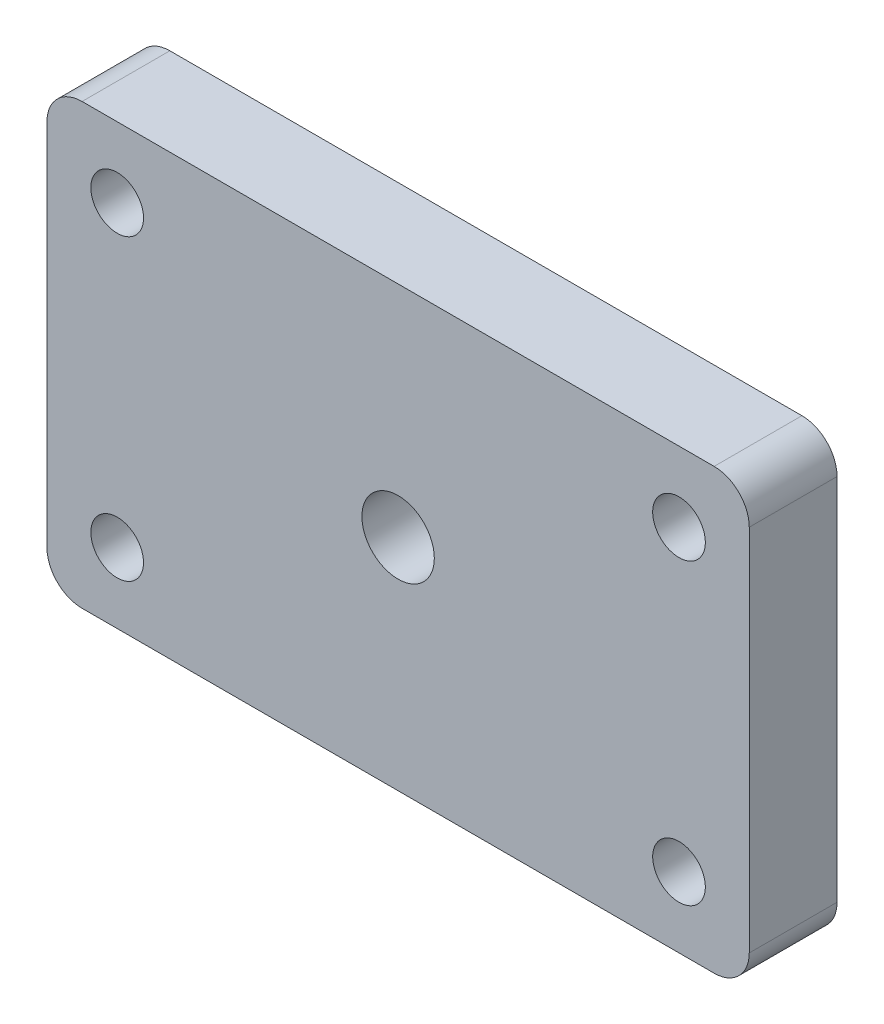
ISO-10303-21;
HEADER;
FILE_DESCRIPTION(('STEP AP214'),'2;1');
FILE_NAME('part.step','',(''),(''),'','','');
FILE_SCHEMA(('AUTOMOTIVE_DESIGN { 1 0 10303 214 1 1 1 1 }'));
ENDSEC;
DATA;
#1=APPLICATION_CONTEXT('core data for automotive mechanical design processes');
#2=APPLICATION_PROTOCOL_DEFINITION('international standard','automotive_design',2000,#1);
#3=PRODUCT_CONTEXT('',#1,'mechanical');
#4=PRODUCT('Part','Part','',(#3));
#5=PRODUCT_RELATED_PRODUCT_CATEGORY('part','',(#4));
#6=PRODUCT_DEFINITION_FORMATION('','',#4);
#7=PRODUCT_DEFINITION_CONTEXT('part definition',#1,'design');
#8=PRODUCT_DEFINITION('design','',#6,#7);
#9=PRODUCT_DEFINITION_SHAPE('','',#8);
#10=(LENGTH_UNIT() NAMED_UNIT(*) SI_UNIT(.MILLI.,.METRE.));
#11=(NAMED_UNIT(*) PLANE_ANGLE_UNIT() SI_UNIT($,.RADIAN.));
#12=(NAMED_UNIT(*) SI_UNIT($,.STERADIAN.) SOLID_ANGLE_UNIT());
#13=UNCERTAINTY_MEASURE_WITH_UNIT(LENGTH_MEASURE(1.E-05),#10,'distance_accuracy_value','');
#14=(GEOMETRIC_REPRESENTATION_CONTEXT(3) GLOBAL_UNCERTAINTY_ASSIGNED_CONTEXT((#13)) GLOBAL_UNIT_ASSIGNED_CONTEXT((#10,
#11,#12)) REPRESENTATION_CONTEXT('',''));
#15=CARTESIAN_POINT('',(0.,0.,0.));
#16=DIRECTION('',(0.,0.,1.));
#17=DIRECTION('',(1.,0.,0.));
#18=AXIS2_PLACEMENT_3D('',#15,#16,#17);
#19=CARTESIAN_POINT('',(-36.,21.,10.));
#20=DIRECTION('',(0.,0.,1.));
#21=DIRECTION('',(1.,0.,0.));
#22=AXIS2_PLACEMENT_3D('',#19,#20,#21);
#23=PLANE('',#22);
#24=CARTESIAN_POINT('',(0.,0.,10.));
#25=DIRECTION('',(0.,0.,1.));
#26=DIRECTION('',(1.,0.,0.));
#27=AXIS2_PLACEMENT_3D('',#24,#25,#26);
#28=CIRCLE('',#27,4.125);
#29=CARTESIAN_POINT('',(4.125,0.,10.));
#30=VERTEX_POINT('',#29);
#31=EDGE_CURVE('E194',#30,#30,#28,.T.);
#32=ORIENTED_EDGE('',*,*,#31,.F.);
#33=EDGE_LOOP('',(#32));
#34=FACE_BOUND('',#33,.T.);
#35=CARTESIAN_POINT('',(-32.,17.,10.));
#36=DIRECTION('',(0.,0.,1.));
#37=DIRECTION('',(1.,0.,0.));
#38=AXIS2_PLACEMENT_3D('',#35,#36,#37);
#39=CIRCLE('',#38,3.00000000000001);
#40=CARTESIAN_POINT('',(-29.,17.,10.));
#41=VERTEX_POINT('',#40);
#42=EDGE_CURVE('E182',#41,#41,#39,.T.);
#43=ORIENTED_EDGE('',*,*,#42,.F.);
#44=EDGE_LOOP('',(#43));
#45=FACE_BOUND('',#44,.T.);
#46=CARTESIAN_POINT('',(-36.,21.,10.));
#47=DIRECTION('',(0.,0.,1.));
#48=DIRECTION('',(1.,0.,0.));
#49=AXIS2_PLACEMENT_3D('',#46,#47,#48);
#50=CIRCLE('',#49,4.00000000000001);
#51=CARTESIAN_POINT('',(-36.,25.,10.));
#52=VERTEX_POINT('',#51);
#53=CARTESIAN_POINT('',(-40.,21.,10.));
#54=VERTEX_POINT('',#53);
#55=EDGE_CURVE('E145',#52,#54,#50,.T.);
#56=ORIENTED_EDGE('',*,*,#55,.T.);
#57=DIRECTION('',(0.,-1.,0.));
#58=VECTOR('',#57,1.);
#59=CARTESIAN_POINT('',(-40.,-21.,10.));
#60=LINE('',#59,#58);
#61=CARTESIAN_POINT('',(-40.,-21.,10.));
#62=VERTEX_POINT('',#61);
#63=EDGE_CURVE('E93',#54,#62,#60,.T.);
#64=ORIENTED_EDGE('',*,*,#63,.T.);
#65=CARTESIAN_POINT('',(-36.,-21.,10.));
#66=DIRECTION('',(0.,0.,1.));
#67=DIRECTION('',(1.,0.,0.));
#68=AXIS2_PLACEMENT_3D('',#65,#66,#67);
#69=CIRCLE('',#68,4.00000000000001);
#70=CARTESIAN_POINT('',(-36.,-25.,10.));
#71=VERTEX_POINT('',#70);
#72=EDGE_CURVE('E160',#62,#71,#69,.T.);
#73=ORIENTED_EDGE('',*,*,#72,.T.);
#74=DIRECTION('',(1.,0.,0.));
#75=VECTOR('',#74,1.);
#76=CARTESIAN_POINT('',(36.,-25.,10.));
#77=LINE('',#76,#75);
#78=CARTESIAN_POINT('',(36.,-25.,10.));
#79=VERTEX_POINT('',#78);
#80=EDGE_CURVE('E173',#71,#79,#77,.T.);
#81=ORIENTED_EDGE('',*,*,#80,.T.);
#82=CARTESIAN_POINT('',(36.,-21.,10.));
#83=DIRECTION('',(0.,0.,1.));
#84=DIRECTION('',(1.,0.,0.));
#85=AXIS2_PLACEMENT_3D('',#82,#83,#84);
#86=CIRCLE('',#85,4.00000000000001);
#87=CARTESIAN_POINT('',(40.,-21.,10.));
#88=VERTEX_POINT('',#87);
#89=EDGE_CURVE('E112',#79,#88,#86,.T.);
#90=ORIENTED_EDGE('',*,*,#89,.T.);
#91=DIRECTION('',(0.,1.,0.));
#92=VECTOR('',#91,1.);
#93=CARTESIAN_POINT('',(40.,21.,10.));
#94=LINE('',#93,#92);
#95=CARTESIAN_POINT('',(40.,21.,10.));
#96=VERTEX_POINT('',#95);
#97=EDGE_CURVE('E106',#88,#96,#94,.T.);
#98=ORIENTED_EDGE('',*,*,#97,.T.);
#99=CARTESIAN_POINT('',(36.,21.,10.));
#100=DIRECTION('',(0.,0.,1.));
#101=DIRECTION('',(1.,0.,0.));
#102=AXIS2_PLACEMENT_3D('',#99,#100,#101);
#103=CIRCLE('',#102,4.);
#104=CARTESIAN_POINT('',(36.,25.,10.));
#105=VERTEX_POINT('',#104);
#106=EDGE_CURVE('E110',#96,#105,#103,.T.);
#107=ORIENTED_EDGE('',*,*,#106,.T.);
#108=DIRECTION('',(-1.,0.,0.));
#109=VECTOR('',#108,1.);
#110=CARTESIAN_POINT('',(-36.,25.,10.));
#111=LINE('',#110,#109);
#112=EDGE_CURVE('E50',#105,#52,#111,.T.);
#113=ORIENTED_EDGE('',*,*,#112,.T.);
#114=EDGE_LOOP('',(#56,#64,#73,#81,#90,#98,#107,#113));
#115=FACE_BOUND('',#114,.T.);
#116=CARTESIAN_POINT('',(32.,17.,10.));
#117=DIRECTION('',(0.,0.,1.));
#118=DIRECTION('',(1.,0.,0.));
#119=AXIS2_PLACEMENT_3D('',#116,#117,#118);
#120=CIRCLE('',#119,3.);
#121=CARTESIAN_POINT('',(35.,17.,10.));
#122=VERTEX_POINT('',#121);
#123=EDGE_CURVE('E134',#122,#122,#120,.T.);
#124=ORIENTED_EDGE('',*,*,#123,.F.);
#125=EDGE_LOOP('',(#124));
#126=FACE_BOUND('',#125,.T.);
#127=CARTESIAN_POINT('',(32.,-17.,10.));
#128=DIRECTION('',(0.,0.,1.));
#129=DIRECTION('',(1.,0.,0.));
#130=AXIS2_PLACEMENT_3D('',#127,#128,#129);
#131=CIRCLE('',#130,3.);
#132=CARTESIAN_POINT('',(35.,-17.,10.));
#133=VERTEX_POINT('',#132);
#134=EDGE_CURVE('E188',#133,#133,#131,.T.);
#135=ORIENTED_EDGE('',*,*,#134,.F.);
#136=EDGE_LOOP('',(#135));
#137=FACE_BOUND('',#136,.T.);
#138=CARTESIAN_POINT('',(-32.,-17.,10.));
#139=DIRECTION('',(0.,0.,1.));
#140=DIRECTION('',(1.,0.,0.));
#141=AXIS2_PLACEMENT_3D('',#138,#139,#140);
#142=CIRCLE('',#141,3.00000000000001);
#143=CARTESIAN_POINT('',(-29.,-17.,10.));
#144=VERTEX_POINT('',#143);
#145=EDGE_CURVE('E200',#144,#144,#142,.T.);
#146=ORIENTED_EDGE('',*,*,#145,.F.);
#147=EDGE_LOOP('',(#146));
#148=FACE_BOUND('',#147,.T.);
#149=ADVANCED_FACE('F33',(#34,#45,#115,#126,#137,#148),#23,.T.);
#150=CARTESIAN_POINT('',(-36.,21.,0.));
#151=DIRECTION('',(0.,0.,1.));
#152=DIRECTION('',(1.,0.,0.));
#153=AXIS2_PLACEMENT_3D('',#150,#151,#152);
#154=PLANE('',#153);
#155=CARTESIAN_POINT('',(-36.,21.,0.));
#156=DIRECTION('',(0.,0.,1.));
#157=DIRECTION('',(1.,0.,0.));
#158=AXIS2_PLACEMENT_3D('',#155,#156,#157);
#159=CIRCLE('',#158,4.00000000000001);
#160=CARTESIAN_POINT('',(-36.,25.,0.));
#161=VERTEX_POINT('',#160);
#162=CARTESIAN_POINT('',(-40.,21.,0.));
#163=VERTEX_POINT('',#162);
#164=EDGE_CURVE('E130',#161,#163,#159,.T.);
#165=ORIENTED_EDGE('',*,*,#164,.F.);
#166=DIRECTION('',(-1.,0.,0.));
#167=VECTOR('',#166,1.);
#168=CARTESIAN_POINT('',(-36.,25.,0.));
#169=LINE('',#168,#167);
#170=CARTESIAN_POINT('',(36.,25.,0.));
#171=VERTEX_POINT('',#170);
#172=EDGE_CURVE('E85',#171,#161,#169,.T.);
#173=ORIENTED_EDGE('',*,*,#172,.F.);
#174=CARTESIAN_POINT('',(36.,21.,0.));
#175=DIRECTION('',(0.,0.,1.));
#176=DIRECTION('',(1.,0.,0.));
#177=AXIS2_PLACEMENT_3D('',#174,#175,#176);
#178=CIRCLE('',#177,4.);
#179=CARTESIAN_POINT('',(40.,21.,0.));
#180=VERTEX_POINT('',#179);
#181=EDGE_CURVE('E79',#180,#171,#178,.T.);
#182=ORIENTED_EDGE('',*,*,#181,.F.);
#183=DIRECTION('',(0.,1.,0.));
#184=VECTOR('',#183,1.);
#185=CARTESIAN_POINT('',(40.,21.,0.));
#186=LINE('',#185,#184);
#187=CARTESIAN_POINT('',(40.,-21.,0.));
#188=VERTEX_POINT('',#187);
#189=EDGE_CURVE('E120',#188,#180,#186,.T.);
#190=ORIENTED_EDGE('',*,*,#189,.F.);
#191=CARTESIAN_POINT('',(36.,-21.,0.));
#192=DIRECTION('',(0.,0.,1.));
#193=DIRECTION('',(1.,0.,0.));
#194=AXIS2_PLACEMENT_3D('',#191,#192,#193);
#195=CIRCLE('',#194,4.00000000000001);
#196=CARTESIAN_POINT('',(36.,-25.,0.));
#197=VERTEX_POINT('',#196);
#198=EDGE_CURVE('E140',#197,#188,#195,.T.);
#199=ORIENTED_EDGE('',*,*,#198,.F.);
#200=DIRECTION('',(1.,0.,0.));
#201=VECTOR('',#200,1.);
#202=CARTESIAN_POINT('',(36.,-25.,0.));
#203=LINE('',#202,#201);
#204=CARTESIAN_POINT('',(-36.,-25.,0.));
#205=VERTEX_POINT('',#204);
#206=EDGE_CURVE('E138',#205,#197,#203,.T.);
#207=ORIENTED_EDGE('',*,*,#206,.F.);
#208=CARTESIAN_POINT('',(-36.,-21.,0.));
#209=DIRECTION('',(0.,0.,1.));
#210=DIRECTION('',(1.,0.,0.));
#211=AXIS2_PLACEMENT_3D('',#208,#209,#210);
#212=CIRCLE('',#211,4.00000000000001);
#213=CARTESIAN_POINT('',(-40.,-21.,0.));
#214=VERTEX_POINT('',#213);
#215=EDGE_CURVE('E136',#214,#205,#212,.T.);
#216=ORIENTED_EDGE('',*,*,#215,.F.);
#217=DIRECTION('',(0.,-1.,0.));
#218=VECTOR('',#217,1.);
#219=CARTESIAN_POINT('',(-40.,-21.,0.));
#220=LINE('',#219,#218);
#221=EDGE_CURVE('E133',#163,#214,#220,.T.);
#222=ORIENTED_EDGE('',*,*,#221,.F.);
#223=EDGE_LOOP('',(#165,#173,#182,#190,#199,#207,#216,#222));
#224=FACE_BOUND('',#223,.T.);
#225=CARTESIAN_POINT('',(32.,17.,0.));
#226=DIRECTION('',(0.,0.,1.));
#227=DIRECTION('',(1.,0.,0.));
#228=AXIS2_PLACEMENT_3D('',#225,#226,#227);
#229=CIRCLE('',#228,3.);
#230=CARTESIAN_POINT('',(35.,17.,0.));
#231=VERTEX_POINT('',#230);
#232=EDGE_CURVE('E179',#231,#231,#229,.T.);
#233=ORIENTED_EDGE('',*,*,#232,.T.);
#234=EDGE_LOOP('',(#233));
#235=FACE_BOUND('',#234,.T.);
#236=CARTESIAN_POINT('',(-32.,17.,0.));
#237=DIRECTION('',(0.,0.,1.));
#238=DIRECTION('',(1.,0.,0.));
#239=AXIS2_PLACEMENT_3D('',#236,#237,#238);
#240=CIRCLE('',#239,3.00000000000001);
#241=CARTESIAN_POINT('',(-29.,17.,0.));
#242=VERTEX_POINT('',#241);
#243=EDGE_CURVE('E185',#242,#242,#240,.T.);
#244=ORIENTED_EDGE('',*,*,#243,.T.);
#245=EDGE_LOOP('',(#244));
#246=FACE_BOUND('',#245,.T.);
#247=CARTESIAN_POINT('',(32.,-17.,0.));
#248=DIRECTION('',(0.,0.,1.));
#249=DIRECTION('',(1.,0.,0.));
#250=AXIS2_PLACEMENT_3D('',#247,#248,#249);
#251=CIRCLE('',#250,3.);
#252=CARTESIAN_POINT('',(35.,-17.,0.));
#253=VERTEX_POINT('',#252);
#254=EDGE_CURVE('E191',#253,#253,#251,.T.);
#255=ORIENTED_EDGE('',*,*,#254,.T.);
#256=EDGE_LOOP('',(#255));
#257=FACE_BOUND('',#256,.T.);
#258=CARTESIAN_POINT('',(0.,0.,0.));
#259=DIRECTION('',(0.,0.,1.));
#260=DIRECTION('',(1.,0.,0.));
#261=AXIS2_PLACEMENT_3D('',#258,#259,#260);
#262=CIRCLE('',#261,4.125);
#263=CARTESIAN_POINT('',(4.125,0.,0.));
#264=VERTEX_POINT('',#263);
#265=EDGE_CURVE('E197',#264,#264,#262,.T.);
#266=ORIENTED_EDGE('',*,*,#265,.T.);
#267=EDGE_LOOP('',(#266));
#268=FACE_BOUND('',#267,.T.);
#269=CARTESIAN_POINT('',(-32.,-17.,0.));
#270=DIRECTION('',(0.,0.,1.));
#271=DIRECTION('',(1.,0.,0.));
#272=AXIS2_PLACEMENT_3D('',#269,#270,#271);
#273=CIRCLE('',#272,3.00000000000001);
#274=CARTESIAN_POINT('',(-29.,-17.,0.));
#275=VERTEX_POINT('',#274);
#276=EDGE_CURVE('E203',#275,#275,#273,.T.);
#277=ORIENTED_EDGE('',*,*,#276,.T.);
#278=EDGE_LOOP('',(#277));
#279=FACE_BOUND('',#278,.T.);
#280=ADVANCED_FACE('F164',(#224,#235,#246,#257,#268,#279),#154,.F.);
#281=CARTESIAN_POINT('',(-36.,21.,10.));
#282=DIRECTION('',(0.,0.,-1.));
#283=DIRECTION('',(-1.,0.,0.));
#284=AXIS2_PLACEMENT_3D('',#281,#282,#283);
#285=CYLINDRICAL_SURFACE('',#284,4.00000000000001);
#286=ORIENTED_EDGE('',*,*,#164,.T.);
#287=DIRECTION('',(0.,0.,-1.));
#288=VECTOR('',#287,1.);
#289=CARTESIAN_POINT('',(-40.,21.,10.));
#290=LINE('',#289,#288);
#291=EDGE_CURVE('E11',#54,#163,#290,.T.);
#292=ORIENTED_EDGE('',*,*,#291,.F.);
#293=ORIENTED_EDGE('',*,*,#55,.F.);
#294=DIRECTION('',(0.,0.,-1.));
#295=VECTOR('',#294,1.);
#296=CARTESIAN_POINT('',(-36.,25.,10.));
#297=LINE('',#296,#295);
#298=EDGE_CURVE('E126',#52,#161,#297,.T.);
#299=ORIENTED_EDGE('',*,*,#298,.T.);
#300=EDGE_LOOP('',(#286,#292,#293,#299));
#301=FACE_BOUND('',#300,.T.);
#302=ADVANCED_FACE('F35',(#301),#285,.T.);
#303=CARTESIAN_POINT('',(-40.,-21.,10.));
#304=DIRECTION('',(1.,0.,0.));
#305=DIRECTION('',(0.,0.,-1.));
#306=AXIS2_PLACEMENT_3D('',#303,#304,#305);
#307=PLANE('',#306);
#308=ORIENTED_EDGE('',*,*,#221,.T.);
#309=DIRECTION('',(0.,0.,-1.));
#310=VECTOR('',#309,1.);
#311=CARTESIAN_POINT('',(-40.,-21.,10.));
#312=LINE('',#311,#310);
#313=EDGE_CURVE('E42',#62,#214,#312,.T.);
#314=ORIENTED_EDGE('',*,*,#313,.F.);
#315=ORIENTED_EDGE('',*,*,#63,.F.);
#316=ORIENTED_EDGE('',*,*,#291,.T.);
#317=EDGE_LOOP('',(#308,#314,#315,#316));
#318=FACE_BOUND('',#317,.T.);
#319=ADVANCED_FACE('F237',(#318),#307,.F.);
#320=CARTESIAN_POINT('',(-36.,-21.,10.));
#321=DIRECTION('',(0.,0.,-1.));
#322=DIRECTION('',(-1.,0.,0.));
#323=AXIS2_PLACEMENT_3D('',#320,#321,#322);
#324=CYLINDRICAL_SURFACE('',#323,4.00000000000001);
#325=ORIENTED_EDGE('',*,*,#215,.T.);
#326=DIRECTION('',(0.,0.,-1.));
#327=VECTOR('',#326,1.);
#328=CARTESIAN_POINT('',(-36.,-25.,10.));
#329=LINE('',#328,#327);
#330=EDGE_CURVE('E152',#71,#205,#329,.T.);
#331=ORIENTED_EDGE('',*,*,#330,.F.);
#332=ORIENTED_EDGE('',*,*,#72,.F.);
#333=ORIENTED_EDGE('',*,*,#313,.T.);
#334=EDGE_LOOP('',(#325,#331,#332,#333));
#335=FACE_BOUND('',#334,.T.);
#336=ADVANCED_FACE('F158',(#335),#324,.T.);
#337=CARTESIAN_POINT('',(36.,-25.,10.));
#338=DIRECTION('',(0.,1.,0.));
#339=DIRECTION('',(0.,0.,1.));
#340=AXIS2_PLACEMENT_3D('',#337,#338,#339);
#341=PLANE('',#340);
#342=ORIENTED_EDGE('',*,*,#206,.T.);
#343=DIRECTION('',(0.,0.,-1.));
#344=VECTOR('',#343,1.);
#345=CARTESIAN_POINT('',(36.,-25.,10.));
#346=LINE('',#345,#344);
#347=EDGE_CURVE('E149',#79,#197,#346,.T.);
#348=ORIENTED_EDGE('',*,*,#347,.F.);
#349=ORIENTED_EDGE('',*,*,#80,.F.);
#350=ORIENTED_EDGE('',*,*,#330,.T.);
#351=EDGE_LOOP('',(#342,#348,#349,#350));
#352=FACE_BOUND('',#351,.T.);
#353=ADVANCED_FACE('F169',(#352),#341,.F.);
#354=CARTESIAN_POINT('',(36.,-21.,10.));
#355=DIRECTION('',(0.,0.,-1.));
#356=DIRECTION('',(-1.,0.,0.));
#357=AXIS2_PLACEMENT_3D('',#354,#355,#356);
#358=CYLINDRICAL_SURFACE('',#357,4.00000000000001);
#359=ORIENTED_EDGE('',*,*,#198,.T.);
#360=DIRECTION('',(0.,0.,-1.));
#361=VECTOR('',#360,1.);
#362=CARTESIAN_POINT('',(40.,-21.,10.));
#363=LINE('',#362,#361);
#364=EDGE_CURVE('E121',#88,#188,#363,.T.);
#365=ORIENTED_EDGE('',*,*,#364,.F.);
#366=ORIENTED_EDGE('',*,*,#89,.F.);
#367=ORIENTED_EDGE('',*,*,#347,.T.);
#368=EDGE_LOOP('',(#359,#365,#366,#367));
#369=FACE_BOUND('',#368,.T.);
#370=ADVANCED_FACE('F172',(#369),#358,.T.);
#371=CARTESIAN_POINT('',(40.,21.,10.));
#372=DIRECTION('',(-1.,0.,0.));
#373=DIRECTION('',(0.,0.,1.));
#374=AXIS2_PLACEMENT_3D('',#371,#372,#373);
#375=PLANE('',#374);
#376=ORIENTED_EDGE('',*,*,#189,.T.);
#377=DIRECTION('',(0.,0.,-1.));
#378=VECTOR('',#377,1.);
#379=CARTESIAN_POINT('',(40.,21.,10.));
#380=LINE('',#379,#378);
#381=EDGE_CURVE('E117',#96,#180,#380,.T.);
#382=ORIENTED_EDGE('',*,*,#381,.F.);
#383=ORIENTED_EDGE('',*,*,#97,.F.);
#384=ORIENTED_EDGE('',*,*,#364,.T.);
#385=EDGE_LOOP('',(#376,#382,#383,#384));
#386=FACE_BOUND('',#385,.T.);
#387=ADVANCED_FACE('F118',(#386),#375,.F.);
#388=CARTESIAN_POINT('',(36.,21.,10.));
#389=DIRECTION('',(0.,0.,-1.));
#390=DIRECTION('',(-1.,0.,0.));
#391=AXIS2_PLACEMENT_3D('',#388,#389,#390);
#392=CYLINDRICAL_SURFACE('',#391,4.);
#393=ORIENTED_EDGE('',*,*,#181,.T.);
#394=DIRECTION('',(0.,0.,-1.));
#395=VECTOR('',#394,1.);
#396=CARTESIAN_POINT('',(36.,25.,10.));
#397=LINE('',#396,#395);
#398=EDGE_CURVE('E122',#105,#171,#397,.T.);
#399=ORIENTED_EDGE('',*,*,#398,.F.);
#400=ORIENTED_EDGE('',*,*,#106,.F.);
#401=ORIENTED_EDGE('',*,*,#381,.T.);
#402=EDGE_LOOP('',(#393,#399,#400,#401));
#403=FACE_BOUND('',#402,.T.);
#404=ADVANCED_FACE('F124',(#403),#392,.T.);
#405=CARTESIAN_POINT('',(-36.,25.,10.));
#406=DIRECTION('',(0.,-1.,0.));
#407=DIRECTION('',(0.,0.,-1.));
#408=AXIS2_PLACEMENT_3D('',#405,#406,#407);
#409=PLANE('',#408);
#410=ORIENTED_EDGE('',*,*,#172,.T.);
#411=ORIENTED_EDGE('',*,*,#298,.F.);
#412=ORIENTED_EDGE('',*,*,#112,.F.);
#413=ORIENTED_EDGE('',*,*,#398,.T.);
#414=EDGE_LOOP('',(#410,#411,#412,#413));
#415=FACE_BOUND('',#414,.T.);
#416=ADVANCED_FACE('F225',(#415),#409,.F.);
#417=CARTESIAN_POINT('',(32.,17.,10.));
#418=DIRECTION('',(0.,0.,-1.));
#419=DIRECTION('',(-1.,0.,0.));
#420=AXIS2_PLACEMENT_3D('',#417,#418,#419);
#421=CYLINDRICAL_SURFACE('',#420,3.);
#422=ORIENTED_EDGE('',*,*,#123,.T.);
#423=EDGE_LOOP('',(#422));
#424=FACE_BOUND('',#423,.T.);
#425=ORIENTED_EDGE('',*,*,#232,.F.);
#426=EDGE_LOOP('',(#425));
#427=FACE_BOUND('',#426,.T.);
#428=ADVANCED_FACE('F222',(#424,#427),#421,.F.);
#429=CARTESIAN_POINT('',(-32.,17.,10.));
#430=DIRECTION('',(0.,0.,-1.));
#431=DIRECTION('',(-1.,0.,0.));
#432=AXIS2_PLACEMENT_3D('',#429,#430,#431);
#433=CYLINDRICAL_SURFACE('',#432,3.00000000000001);
#434=ORIENTED_EDGE('',*,*,#42,.T.);
#435=EDGE_LOOP('',(#434));
#436=FACE_BOUND('',#435,.T.);
#437=ORIENTED_EDGE('',*,*,#243,.F.);
#438=EDGE_LOOP('',(#437));
#439=FACE_BOUND('',#438,.T.);
#440=ADVANCED_FACE('F301',(#436,#439),#433,.F.);
#441=CARTESIAN_POINT('',(32.,-17.,10.));
#442=DIRECTION('',(0.,0.,-1.));
#443=DIRECTION('',(-1.,0.,0.));
#444=AXIS2_PLACEMENT_3D('',#441,#442,#443);
#445=CYLINDRICAL_SURFACE('',#444,3.);
#446=ORIENTED_EDGE('',*,*,#134,.T.);
#447=EDGE_LOOP('',(#446));
#448=FACE_BOUND('',#447,.T.);
#449=ORIENTED_EDGE('',*,*,#254,.F.);
#450=EDGE_LOOP('',(#449));
#451=FACE_BOUND('',#450,.T.);
#452=ADVANCED_FACE('F309',(#448,#451),#445,.F.);
#453=CARTESIAN_POINT('',(0.,0.,10.));
#454=DIRECTION('',(0.,0.,-1.));
#455=DIRECTION('',(-1.,0.,0.));
#456=AXIS2_PLACEMENT_3D('',#453,#454,#455);
#457=CYLINDRICAL_SURFACE('',#456,4.125);
#458=ORIENTED_EDGE('',*,*,#31,.T.);
#459=EDGE_LOOP('',(#458));
#460=FACE_BOUND('',#459,.T.);
#461=ORIENTED_EDGE('',*,*,#265,.F.);
#462=EDGE_LOOP('',(#461));
#463=FACE_BOUND('',#462,.T.);
#464=ADVANCED_FACE('F317',(#460,#463),#457,.F.);
#465=CARTESIAN_POINT('',(-32.,-17.,10.));
#466=DIRECTION('',(0.,0.,-1.));
#467=DIRECTION('',(-1.,0.,0.));
#468=AXIS2_PLACEMENT_3D('',#465,#466,#467);
#469=CYLINDRICAL_SURFACE('',#468,3.00000000000001);
#470=ORIENTED_EDGE('',*,*,#145,.T.);
#471=EDGE_LOOP('',(#470));
#472=FACE_BOUND('',#471,.T.);
#473=ORIENTED_EDGE('',*,*,#276,.F.);
#474=EDGE_LOOP('',(#473));
#475=FACE_BOUND('',#474,.T.);
#476=ADVANCED_FACE('F209',(#472,#475),#469,.F.);
#477=CLOSED_SHELL('',(#149,#280,#302,#319,#336,#353,#370,#387,#404,#416,#428,#440,#452,#464,#476));
#478=MANIFOLD_SOLID_BREP('B2',#477);
#479=ADVANCED_BREP_SHAPE_REPRESENTATION('',(#18,#478),#14);
#480=SHAPE_DEFINITION_REPRESENTATION(#9,#479);
ENDSEC;
END-ISO-10303-21;
